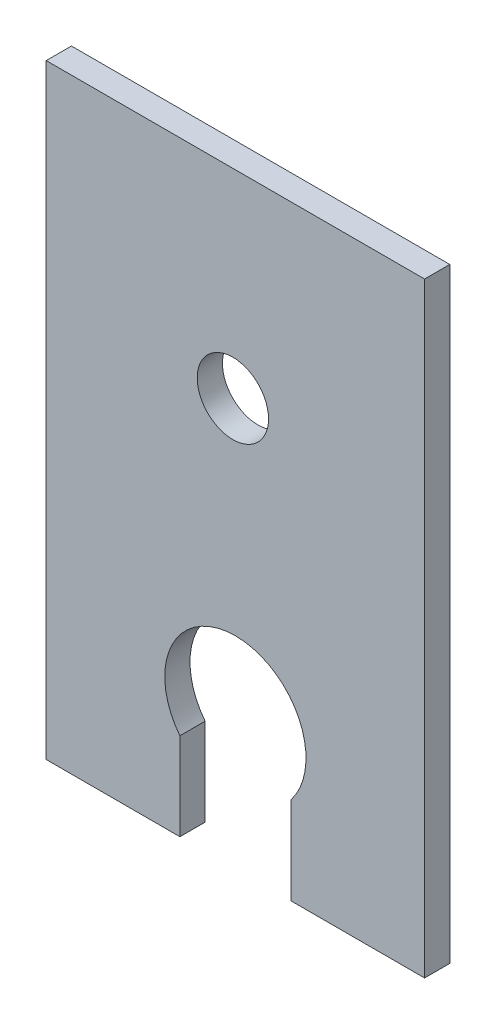
ISO-10303-21;
HEADER;
FILE_DESCRIPTION(('STEP AP214'),'2;1');
FILE_NAME('part.step','',(''),(''),'','','');
FILE_SCHEMA(('AUTOMOTIVE_DESIGN { 1 0 10303 214 1 1 1 1 }'));
ENDSEC;
DATA;
#1=APPLICATION_CONTEXT('core data for automotive mechanical design processes');
#2=APPLICATION_PROTOCOL_DEFINITION('international standard','automotive_design',2000,#1);
#3=PRODUCT_CONTEXT('',#1,'mechanical');
#4=PRODUCT('Part','Part','',(#3));
#5=PRODUCT_RELATED_PRODUCT_CATEGORY('part','',(#4));
#6=PRODUCT_DEFINITION_FORMATION('','',#4);
#7=PRODUCT_DEFINITION_CONTEXT('part definition',#1,'design');
#8=PRODUCT_DEFINITION('design','',#6,#7);
#9=PRODUCT_DEFINITION_SHAPE('','',#8);
#10=(LENGTH_UNIT() NAMED_UNIT(*) SI_UNIT(.MILLI.,.METRE.));
#11=(NAMED_UNIT(*) PLANE_ANGLE_UNIT() SI_UNIT($,.RADIAN.));
#12=(NAMED_UNIT(*) SI_UNIT($,.STERADIAN.) SOLID_ANGLE_UNIT());
#13=UNCERTAINTY_MEASURE_WITH_UNIT(LENGTH_MEASURE(1.E-05),#10,'distance_accuracy_value','');
#14=(GEOMETRIC_REPRESENTATION_CONTEXT(3) GLOBAL_UNCERTAINTY_ASSIGNED_CONTEXT((#13)) GLOBAL_UNIT_ASSIGNED_CONTEXT((#10,
#11,#12)) REPRESENTATION_CONTEXT('',''));
#15=CARTESIAN_POINT('',(0.,0.,0.));
#16=DIRECTION('',(0.,0.,1.));
#17=DIRECTION('',(1.,0.,0.));
#18=AXIS2_PLACEMENT_3D('',#15,#16,#17);
#19=CARTESIAN_POINT('',(0.,0.,10.));
#20=DIRECTION('',(0.,1.,0.));
#21=DIRECTION('',(0.,0.,1.));
#22=AXIS2_PLACEMENT_3D('',#19,#20,#21);
#23=PLANE('',#22);
#24=DIRECTION('',(1.,0.,0.));
#25=VECTOR('',#24,1.);
#26=CARTESIAN_POINT('',(0.,0.,0.));
#27=LINE('',#26,#25);
#28=CARTESIAN_POINT('',(0.,0.,0.));
#29=VERTEX_POINT('',#28);
#30=CARTESIAN_POINT('',(53.,0.,0.));
#31=VERTEX_POINT('',#30);
#32=EDGE_CURVE('E115',#29,#31,#27,.T.);
#33=ORIENTED_EDGE('',*,*,#32,.T.);
#34=DIRECTION('',(0.,0.,1.));
#35=VECTOR('',#34,1.);
#36=CARTESIAN_POINT('',(53.,0.,0.));
#37=LINE('',#36,#35);
#38=CARTESIAN_POINT('',(53.,0.,10.0000000000001));
#39=VERTEX_POINT('',#38);
#40=EDGE_CURVE('E103',#31,#39,#37,.T.);
#41=ORIENTED_EDGE('',*,*,#40,.T.);
#42=DIRECTION('',(1.,0.,0.));
#43=VECTOR('',#42,1.);
#44=CARTESIAN_POINT('',(0.,0.,10.));
#45=LINE('',#44,#43);
#46=CARTESIAN_POINT('',(0.,0.,10.));
#47=VERTEX_POINT('',#46);
#48=EDGE_CURVE('E114',#47,#39,#45,.T.);
#49=ORIENTED_EDGE('',*,*,#48,.F.);
#50=DIRECTION('',(0.,0.,-1.));
#51=VECTOR('',#50,1.);
#52=CARTESIAN_POINT('',(0.,0.,10.));
#53=LINE('',#52,#51);
#54=EDGE_CURVE('E12',#47,#29,#53,.T.);
#55=ORIENTED_EDGE('',*,*,#54,.T.);
#56=EDGE_LOOP('',(#33,#41,#49,#55));
#57=FACE_BOUND('',#56,.T.);
#58=ADVANCED_FACE('F34',(#57),#23,.F.);
#59=CARTESIAN_POINT('',(0.,0.,10.));
#60=DIRECTION('',(1.,0.,0.));
#61=DIRECTION('',(0.,0.,-1.));
#62=AXIS2_PLACEMENT_3D('',#59,#60,#61);
#63=PLANE('',#62);
#64=DIRECTION('',(0.,-1.,0.));
#65=VECTOR('',#64,1.);
#66=CARTESIAN_POINT('',(0.,0.,0.));
#67=LINE('',#66,#65);
#68=CARTESIAN_POINT('',(0.,240.,0.));
#69=VERTEX_POINT('',#68);
#70=EDGE_CURVE('E156',#69,#29,#67,.T.);
#71=ORIENTED_EDGE('',*,*,#70,.T.);
#72=ORIENTED_EDGE('',*,*,#54,.F.);
#73=DIRECTION('',(0.,-1.,0.));
#74=VECTOR('',#73,1.);
#75=CARTESIAN_POINT('',(0.,0.,10.));
#76=LINE('',#75,#74);
#77=CARTESIAN_POINT('',(0.,240.,10.));
#78=VERTEX_POINT('',#77);
#79=EDGE_CURVE('E120',#78,#47,#76,.T.);
#80=ORIENTED_EDGE('',*,*,#79,.F.);
#81=DIRECTION('',(0.,0.,-1.));
#82=VECTOR('',#81,1.);
#83=CARTESIAN_POINT('',(0.,240.,10.));
#84=LINE('',#83,#82);
#85=EDGE_CURVE('E130',#78,#69,#84,.T.);
#86=ORIENTED_EDGE('',*,*,#85,.T.);
#87=EDGE_LOOP('',(#71,#72,#80,#86));
#88=FACE_BOUND('',#87,.T.);
#89=ADVANCED_FACE('F36',(#88),#63,.F.);
#90=CARTESIAN_POINT('',(97.,0.,10.0000000000002));
#91=VERTEX_POINT('',#90);
#92=CARTESIAN_POINT('',(150.,0.,10.0000000000003));
#93=VERTEX_POINT('',#92);
#94=EDGE_CURVE('E123',#91,#93,#45,.T.);
#95=ORIENTED_EDGE('',*,*,#94,.F.);
#96=DIRECTION('',(0.,0.,1.));
#97=VECTOR('',#96,1.);
#98=CARTESIAN_POINT('',(97.,0.,1.72306613421824E-13));
#99=LINE('',#98,#97);
#100=CARTESIAN_POINT('',(97.,0.,1.72306613421824E-13));
#101=VERTEX_POINT('',#100);
#102=EDGE_CURVE('E116',#101,#91,#99,.T.);
#103=ORIENTED_EDGE('',*,*,#102,.F.);
#104=CARTESIAN_POINT('',(150.,0.,2.66453525910037E-13));
#105=VERTEX_POINT('',#104);
#106=EDGE_CURVE('E150',#101,#105,#27,.T.);
#107=ORIENTED_EDGE('',*,*,#106,.T.);
#108=DIRECTION('',(0.,0.,-1.));
#109=VECTOR('',#108,1.);
#110=CARTESIAN_POINT('',(150.,0.,10.0000000000003));
#111=LINE('',#110,#109);
#112=EDGE_CURVE('E42',#93,#105,#111,.T.);
#113=ORIENTED_EDGE('',*,*,#112,.F.);
#114=EDGE_LOOP('',(#95,#103,#107,#113));
#115=FACE_BOUND('',#114,.T.);
#116=ADVANCED_FACE('F192',(#115),#23,.F.);
#117=CARTESIAN_POINT('',(150.,0.,10.0000000000003));
#118=DIRECTION('',(-1.,0.,0.));
#119=DIRECTION('',(0.,0.,1.));
#120=AXIS2_PLACEMENT_3D('',#117,#118,#119);
#121=PLANE('',#120);
#122=DIRECTION('',(0.,1.,0.));
#123=VECTOR('',#122,1.);
#124=CARTESIAN_POINT('',(150.,0.,2.66453525910037E-13));
#125=LINE('',#124,#123);
#126=CARTESIAN_POINT('',(150.,240.,2.66453525910037E-13));
#127=VERTEX_POINT('',#126);
#128=EDGE_CURVE('E142',#105,#127,#125,.T.);
#129=ORIENTED_EDGE('',*,*,#128,.T.);
#130=DIRECTION('',(0.,0.,-1.));
#131=VECTOR('',#130,1.);
#132=CARTESIAN_POINT('',(150.,240.,10.0000000000003));
#133=LINE('',#132,#131);
#134=CARTESIAN_POINT('',(150.,240.,10.0000000000003));
#135=VERTEX_POINT('',#134);
#136=EDGE_CURVE('E133',#135,#127,#133,.T.);
#137=ORIENTED_EDGE('',*,*,#136,.F.);
#138=DIRECTION('',(0.,1.,0.));
#139=VECTOR('',#138,1.);
#140=CARTESIAN_POINT('',(150.,0.,10.0000000000003));
#141=LINE('',#140,#139);
#142=EDGE_CURVE('E122',#93,#135,#141,.T.);
#143=ORIENTED_EDGE('',*,*,#142,.F.);
#144=ORIENTED_EDGE('',*,*,#112,.T.);
#145=EDGE_LOOP('',(#129,#137,#143,#144));
#146=FACE_BOUND('',#145,.T.);
#147=ADVANCED_FACE('F140',(#146),#121,.F.);
#148=CARTESIAN_POINT('',(0.,240.,10.));
#149=DIRECTION('',(0.,-1.,0.));
#150=DIRECTION('',(0.,0.,-1.));
#151=AXIS2_PLACEMENT_3D('',#148,#149,#150);
#152=PLANE('',#151);
#153=DIRECTION('',(-1.,0.,0.));
#154=VECTOR('',#153,1.);
#155=CARTESIAN_POINT('',(0.,240.,0.));
#156=LINE('',#155,#154);
#157=EDGE_CURVE('E152',#127,#69,#156,.T.);
#158=ORIENTED_EDGE('',*,*,#157,.T.);
#159=ORIENTED_EDGE('',*,*,#85,.F.);
#160=DIRECTION('',(-1.,0.,0.));
#161=VECTOR('',#160,1.);
#162=CARTESIAN_POINT('',(0.,240.,10.));
#163=LINE('',#162,#161);
#164=EDGE_CURVE('E57',#135,#78,#163,.T.);
#165=ORIENTED_EDGE('',*,*,#164,.F.);
#166=ORIENTED_EDGE('',*,*,#136,.T.);
#167=EDGE_LOOP('',(#158,#159,#165,#166));
#168=FACE_BOUND('',#167,.T.);
#169=ADVANCED_FACE('F181',(#168),#152,.F.);
#170=CARTESIAN_POINT('',(0.,240.,10.));
#171=DIRECTION('',(0.,0.,-1.));
#172=DIRECTION('',(-1.,0.,0.));
#173=AXIS2_PLACEMENT_3D('',#170,#171,#172);
#174=PLANE('',#173);
#175=CARTESIAN_POINT('',(74.,161.,10.));
#176=DIRECTION('',(0.,0.,1.));
#177=DIRECTION('',(1.,0.,0.));
#178=AXIS2_PLACEMENT_3D('',#175,#176,#177);
#179=CIRCLE('',#178,14.1421356237309);
#180=CARTESIAN_POINT('',(88.142135623731,161.,10.));
#181=VERTEX_POINT('',#180);
#182=EDGE_CURVE('E174',#181,#181,#179,.T.);
#183=ORIENTED_EDGE('',*,*,#182,.F.);
#184=EDGE_LOOP('',(#183));
#185=FACE_BOUND('',#184,.T.);
#186=ORIENTED_EDGE('',*,*,#48,.T.);
#187=DIRECTION('',(0.,-1.,0.));
#188=VECTOR('',#187,1.);
#189=CARTESIAN_POINT('',(53.,0.,10.0000000000001));
#190=LINE('',#189,#188);
#191=CARTESIAN_POINT('',(53.,34.6794919243113,10.0000000000001));
#192=VERTEX_POINT('',#191);
#193=EDGE_CURVE('E99',#192,#39,#190,.T.);
#194=ORIENTED_EDGE('',*,*,#193,.F.);
#195=CARTESIAN_POINT('',(75.,52.,10.0000000000001));
#196=DIRECTION('',(0.,0.,1.));
#197=DIRECTION('',(1.,0.,0.));
#198=AXIS2_PLACEMENT_3D('',#195,#196,#197);
#199=CIRCLE('',#198,28.);
#200=CARTESIAN_POINT('',(97.,34.6794919243113,10.0000000000002));
#201=VERTEX_POINT('',#200);
#202=EDGE_CURVE('E168',#201,#192,#199,.T.);
#203=ORIENTED_EDGE('',*,*,#202,.F.);
#204=DIRECTION('',(0.,1.,0.));
#205=VECTOR('',#204,1.);
#206=CARTESIAN_POINT('',(97.,0.,10.0000000000002));
#207=LINE('',#206,#205);
#208=EDGE_CURVE('E109',#91,#201,#207,.T.);
#209=ORIENTED_EDGE('',*,*,#208,.F.);
#210=ORIENTED_EDGE('',*,*,#94,.T.);
#211=ORIENTED_EDGE('',*,*,#142,.T.);
#212=ORIENTED_EDGE('',*,*,#164,.T.);
#213=ORIENTED_EDGE('',*,*,#79,.T.);
#214=EDGE_LOOP('',(#186,#194,#203,#209,#210,#211,#212,#213));
#215=FACE_BOUND('',#214,.T.);
#216=ADVANCED_FACE('F118',(#185,#215),#174,.F.);
#217=CARTESIAN_POINT('',(0.,240.,0.));
#218=DIRECTION('',(0.,0.,-1.));
#219=DIRECTION('',(-1.,0.,0.));
#220=AXIS2_PLACEMENT_3D('',#217,#218,#219);
#221=PLANE('',#220);
#222=CARTESIAN_POINT('',(74.,161.,0.));
#223=DIRECTION('',(0.,0.,1.));
#224=DIRECTION('',(1.,0.,0.));
#225=AXIS2_PLACEMENT_3D('',#222,#223,#224);
#226=CIRCLE('',#225,14.1421356237309);
#227=CARTESIAN_POINT('',(88.142135623731,161.,0.));
#228=VERTEX_POINT('',#227);
#229=EDGE_CURVE('E110',#228,#228,#226,.T.);
#230=ORIENTED_EDGE('',*,*,#229,.T.);
#231=EDGE_LOOP('',(#230));
#232=FACE_BOUND('',#231,.T.);
#233=DIRECTION('',(0.,-1.,0.));
#234=VECTOR('',#233,1.);
#235=CARTESIAN_POINT('',(53.,0.,0.));
#236=LINE('',#235,#234);
#237=CARTESIAN_POINT('',(53.,34.6794919243113,0.));
#238=VERTEX_POINT('',#237);
#239=EDGE_CURVE('E166',#238,#31,#236,.T.);
#240=ORIENTED_EDGE('',*,*,#239,.T.);
#241=ORIENTED_EDGE('',*,*,#32,.F.);
#242=ORIENTED_EDGE('',*,*,#70,.F.);
#243=ORIENTED_EDGE('',*,*,#157,.F.);
#244=ORIENTED_EDGE('',*,*,#128,.F.);
#245=ORIENTED_EDGE('',*,*,#106,.F.);
#246=DIRECTION('',(0.,1.,0.));
#247=VECTOR('',#246,1.);
#248=CARTESIAN_POINT('',(97.,0.,1.72306613421824E-13));
#249=LINE('',#248,#247);
#250=CARTESIAN_POINT('',(97.,34.6794919243113,1.72306613421824E-13));
#251=VERTEX_POINT('',#250);
#252=EDGE_CURVE('E164',#101,#251,#249,.T.);
#253=ORIENTED_EDGE('',*,*,#252,.T.);
#254=CARTESIAN_POINT('',(75.,52.,1.33226762955019E-13));
#255=DIRECTION('',(0.,0.,1.));
#256=DIRECTION('',(1.,0.,0.));
#257=AXIS2_PLACEMENT_3D('',#254,#255,#256);
#258=CIRCLE('',#257,28.);
#259=EDGE_CURVE('E49',#251,#238,#258,.T.);
#260=ORIENTED_EDGE('',*,*,#259,.T.);
#261=EDGE_LOOP('',(#240,#241,#242,#243,#244,#245,#253,#260));
#262=FACE_BOUND('',#261,.T.);
#263=ADVANCED_FACE('F148',(#232,#262),#221,.T.);
#264=CARTESIAN_POINT('',(53.,0.,0.));
#265=DIRECTION('',(-1.,0.,0.));
#266=DIRECTION('',(0.,0.,1.));
#267=AXIS2_PLACEMENT_3D('',#264,#265,#266);
#268=PLANE('',#267);
#269=ORIENTED_EDGE('',*,*,#193,.T.);
#270=ORIENTED_EDGE('',*,*,#40,.F.);
#271=ORIENTED_EDGE('',*,*,#239,.F.);
#272=DIRECTION('',(0.,0.,1.));
#273=VECTOR('',#272,1.);
#274=CARTESIAN_POINT('',(53.,34.6794919243113,0.));
#275=LINE('',#274,#273);
#276=EDGE_CURVE('E105',#238,#192,#275,.T.);
#277=ORIENTED_EDGE('',*,*,#276,.T.);
#278=EDGE_LOOP('',(#269,#270,#271,#277));
#279=FACE_BOUND('',#278,.T.);
#280=ADVANCED_FACE('F101',(#279),#268,.F.);
#281=CARTESIAN_POINT('',(75.,52.,1.33226762955019E-13));
#282=DIRECTION('',(0.,0.,1.));
#283=DIRECTION('',(1.,0.,0.));
#284=AXIS2_PLACEMENT_3D('',#281,#282,#283);
#285=CYLINDRICAL_SURFACE('',#284,28.);
#286=ORIENTED_EDGE('',*,*,#202,.T.);
#287=ORIENTED_EDGE('',*,*,#276,.F.);
#288=ORIENTED_EDGE('',*,*,#259,.F.);
#289=DIRECTION('',(0.,0.,1.));
#290=VECTOR('',#289,1.);
#291=CARTESIAN_POINT('',(97.,34.6794919243113,1.72306613421824E-13));
#292=LINE('',#291,#290);
#293=EDGE_CURVE('E160',#251,#201,#292,.T.);
#294=ORIENTED_EDGE('',*,*,#293,.T.);
#295=EDGE_LOOP('',(#286,#287,#288,#294));
#296=FACE_BOUND('',#295,.T.);
#297=ADVANCED_FACE('F206',(#296),#285,.F.);
#298=CARTESIAN_POINT('',(97.,0.,1.72306613421824E-13));
#299=DIRECTION('',(1.,0.,0.));
#300=DIRECTION('',(0.,0.,-1.));
#301=AXIS2_PLACEMENT_3D('',#298,#299,#300);
#302=PLANE('',#301);
#303=ORIENTED_EDGE('',*,*,#208,.T.);
#304=ORIENTED_EDGE('',*,*,#293,.F.);
#305=ORIENTED_EDGE('',*,*,#252,.F.);
#306=ORIENTED_EDGE('',*,*,#102,.T.);
#307=EDGE_LOOP('',(#303,#304,#305,#306));
#308=FACE_BOUND('',#307,.T.);
#309=ADVANCED_FACE('F205',(#308),#302,.F.);
#310=CARTESIAN_POINT('',(74.,161.,0.));
#311=DIRECTION('',(0.,0.,1.));
#312=DIRECTION('',(1.,0.,0.));
#313=AXIS2_PLACEMENT_3D('',#310,#311,#312);
#314=CYLINDRICAL_SURFACE('',#313,14.1421356237309);
#315=ORIENTED_EDGE('',*,*,#229,.F.);
#316=EDGE_LOOP('',(#315));
#317=FACE_BOUND('',#316,.T.);
#318=ORIENTED_EDGE('',*,*,#182,.T.);
#319=EDGE_LOOP('',(#318));
#320=FACE_BOUND('',#319,.T.);
#321=ADVANCED_FACE('F178',(#317,#320),#314,.F.);
#322=CLOSED_SHELL('',(#58,#89,#116,#147,#169,#216,#263,#280,#297,#309,#321));
#323=MANIFOLD_SOLID_BREP('B2',#322);
#324=ADVANCED_BREP_SHAPE_REPRESENTATION('',(#18,#323),#14);
#325=SHAPE_DEFINITION_REPRESENTATION(#9,#324);
ENDSEC;
END-ISO-10303-21;
